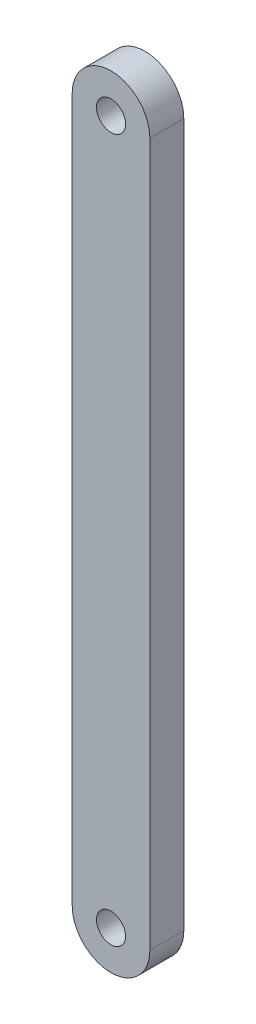
ISO-10303-21;
HEADER;
FILE_DESCRIPTION(('STEP AP214'),'2;1');
FILE_NAME('part.step','',(''),(''),'','','');
FILE_SCHEMA(('AUTOMOTIVE_DESIGN { 1 0 10303 214 1 1 1 1 }'));
ENDSEC;
DATA;
#1=APPLICATION_CONTEXT('core data for automotive mechanical design processes');
#2=APPLICATION_PROTOCOL_DEFINITION('international standard','automotive_design',2000,#1);
#3=PRODUCT_CONTEXT('',#1,'mechanical');
#4=PRODUCT('Part','Part','',(#3));
#5=PRODUCT_RELATED_PRODUCT_CATEGORY('part','',(#4));
#6=PRODUCT_DEFINITION_FORMATION('','',#4);
#7=PRODUCT_DEFINITION_CONTEXT('part definition',#1,'design');
#8=PRODUCT_DEFINITION('design','',#6,#7);
#9=PRODUCT_DEFINITION_SHAPE('','',#8);
#10=(LENGTH_UNIT() NAMED_UNIT(*) SI_UNIT(.MILLI.,.METRE.));
#11=(NAMED_UNIT(*) PLANE_ANGLE_UNIT() SI_UNIT($,.RADIAN.));
#12=(NAMED_UNIT(*) SI_UNIT($,.STERADIAN.) SOLID_ANGLE_UNIT());
#13=UNCERTAINTY_MEASURE_WITH_UNIT(LENGTH_MEASURE(1.E-05),#10,'distance_accuracy_value','');
#14=(GEOMETRIC_REPRESENTATION_CONTEXT(3) GLOBAL_UNCERTAINTY_ASSIGNED_CONTEXT((#13)) GLOBAL_UNIT_ASSIGNED_CONTEXT((#10,
#11,#12)) REPRESENTATION_CONTEXT('',''));
#15=CARTESIAN_POINT('',(0.,0.,0.));
#16=DIRECTION('',(0.,0.,1.));
#17=DIRECTION('',(1.,0.,0.));
#18=AXIS2_PLACEMENT_3D('',#15,#16,#17);
#19=CARTESIAN_POINT('',(0.,72.5,3.5));
#20=DIRECTION('',(0.,0.,-1.));
#21=DIRECTION('',(-1.,0.,0.));
#22=AXIS2_PLACEMENT_3D('',#19,#20,#21);
#23=PLANE('',#22);
#24=CARTESIAN_POINT('',(0.,72.5,3.5));
#25=DIRECTION('',(0.,0.,1.));
#26=DIRECTION('',(-1.,0.,0.));
#27=AXIS2_PLACEMENT_3D('',#24,#25,#26);
#28=CIRCLE('',#27,4.);
#29=CARTESIAN_POINT('',(4.,72.5,3.5));
#30=VERTEX_POINT('',#29);
#31=CARTESIAN_POINT('',(-4.,72.5,3.5));
#32=VERTEX_POINT('',#31);
#33=EDGE_CURVE('E89',#30,#32,#28,.T.);
#34=ORIENTED_EDGE('',*,*,#33,.T.);
#35=DIRECTION('',(0.,-1.,0.));
#36=VECTOR('',#35,1.);
#37=CARTESIAN_POINT('',(-4.,72.5,3.5));
#38=LINE('',#37,#36);
#39=CARTESIAN_POINT('',(-4.,0.,3.5));
#40=VERTEX_POINT('',#39);
#41=EDGE_CURVE('E84',#32,#40,#38,.T.);
#42=ORIENTED_EDGE('',*,*,#41,.T.);
#43=CARTESIAN_POINT('',(0.,0.,3.5));
#44=DIRECTION('',(0.,0.,1.));
#45=DIRECTION('',(1.,0.,0.));
#46=AXIS2_PLACEMENT_3D('',#43,#44,#45);
#47=CIRCLE('',#46,4.);
#48=CARTESIAN_POINT('',(4.,0.,3.5));
#49=VERTEX_POINT('',#48);
#50=EDGE_CURVE('E87',#40,#49,#47,.T.);
#51=ORIENTED_EDGE('',*,*,#50,.T.);
#52=DIRECTION('',(0.,1.,0.));
#53=VECTOR('',#52,1.);
#54=CARTESIAN_POINT('',(4.,0.,3.5));
#55=LINE('',#54,#53);
#56=EDGE_CURVE('E54',#49,#30,#55,.T.);
#57=ORIENTED_EDGE('',*,*,#56,.T.);
#58=EDGE_LOOP('',(#34,#42,#51,#57));
#59=FACE_BOUND('',#58,.T.);
#60=CARTESIAN_POINT('',(0.,72.5,3.5));
#61=DIRECTION('',(0.,0.,1.));
#62=DIRECTION('',(1.,0.,0.));
#63=AXIS2_PLACEMENT_3D('',#60,#61,#62);
#64=CIRCLE('',#63,1.5);
#65=CARTESIAN_POINT('',(1.5,72.5,3.5));
#66=VERTEX_POINT('',#65);
#67=EDGE_CURVE('E104',#66,#66,#64,.T.);
#68=ORIENTED_EDGE('',*,*,#67,.F.);
#69=EDGE_LOOP('',(#68));
#70=FACE_BOUND('',#69,.T.);
#71=CARTESIAN_POINT('',(0.,0.,3.5));
#72=DIRECTION('',(0.,0.,1.));
#73=DIRECTION('',(1.,0.,0.));
#74=AXIS2_PLACEMENT_3D('',#71,#72,#73);
#75=CIRCLE('',#74,1.5);
#76=CARTESIAN_POINT('',(1.5,0.,3.5));
#77=VERTEX_POINT('',#76);
#78=EDGE_CURVE('E119',#77,#77,#75,.T.);
#79=ORIENTED_EDGE('',*,*,#78,.F.);
#80=EDGE_LOOP('',(#79));
#81=FACE_BOUND('',#80,.T.);
#82=ADVANCED_FACE('F37',(#59,#70,#81),#23,.F.);
#83=CARTESIAN_POINT('',(0.,72.5,0.));
#84=DIRECTION('',(0.,0.,-1.));
#85=DIRECTION('',(-1.,0.,0.));
#86=AXIS2_PLACEMENT_3D('',#83,#84,#85);
#87=PLANE('',#86);
#88=CARTESIAN_POINT('',(0.,72.5,0.));
#89=DIRECTION('',(0.,0.,1.));
#90=DIRECTION('',(1.,0.,0.));
#91=AXIS2_PLACEMENT_3D('',#88,#89,#90);
#92=CIRCLE('',#91,1.5);
#93=CARTESIAN_POINT('',(1.5,72.5,0.));
#94=VERTEX_POINT('',#93);
#95=EDGE_CURVE('E116',#94,#94,#92,.T.);
#96=ORIENTED_EDGE('',*,*,#95,.T.);
#97=EDGE_LOOP('',(#96));
#98=FACE_BOUND('',#97,.T.);
#99=CARTESIAN_POINT('',(0.,72.5,0.));
#100=DIRECTION('',(0.,0.,1.));
#101=DIRECTION('',(-1.,0.,0.));
#102=AXIS2_PLACEMENT_3D('',#99,#100,#101);
#103=CIRCLE('',#102,4.);
#104=CARTESIAN_POINT('',(4.,72.5,0.));
#105=VERTEX_POINT('',#104);
#106=CARTESIAN_POINT('',(-4.,72.5,0.));
#107=VERTEX_POINT('',#106);
#108=EDGE_CURVE('E101',#105,#107,#103,.T.);
#109=ORIENTED_EDGE('',*,*,#108,.F.);
#110=DIRECTION('',(0.,1.,0.));
#111=VECTOR('',#110,1.);
#112=CARTESIAN_POINT('',(4.,0.,0.));
#113=LINE('',#112,#111);
#114=CARTESIAN_POINT('',(4.,0.,0.));
#115=VERTEX_POINT('',#114);
#116=EDGE_CURVE('E77',#115,#105,#113,.T.);
#117=ORIENTED_EDGE('',*,*,#116,.F.);
#118=CARTESIAN_POINT('',(0.,0.,0.));
#119=DIRECTION('',(0.,0.,1.));
#120=DIRECTION('',(1.,0.,0.));
#121=AXIS2_PLACEMENT_3D('',#118,#119,#120);
#122=CIRCLE('',#121,4.);
#123=CARTESIAN_POINT('',(-4.,0.,0.));
#124=VERTEX_POINT('',#123);
#125=EDGE_CURVE('E71',#124,#115,#122,.T.);
#126=ORIENTED_EDGE('',*,*,#125,.F.);
#127=DIRECTION('',(0.,-1.,0.));
#128=VECTOR('',#127,1.);
#129=CARTESIAN_POINT('',(-4.,72.5,0.));
#130=LINE('',#129,#128);
#131=EDGE_CURVE('E93',#107,#124,#130,.T.);
#132=ORIENTED_EDGE('',*,*,#131,.F.);
#133=EDGE_LOOP('',(#109,#117,#126,#132));
#134=FACE_BOUND('',#133,.T.);
#135=CARTESIAN_POINT('',(0.,0.,0.));
#136=DIRECTION('',(0.,0.,1.));
#137=DIRECTION('',(1.,0.,0.));
#138=AXIS2_PLACEMENT_3D('',#135,#136,#137);
#139=CIRCLE('',#138,1.5);
#140=CARTESIAN_POINT('',(1.5,0.,0.));
#141=VERTEX_POINT('',#140);
#142=EDGE_CURVE('E122',#141,#141,#139,.T.);
#143=ORIENTED_EDGE('',*,*,#142,.T.);
#144=EDGE_LOOP('',(#143));
#145=FACE_BOUND('',#144,.T.);
#146=ADVANCED_FACE('F112',(#98,#134,#145),#87,.T.);
#147=CARTESIAN_POINT('',(0.,72.5,3.5));
#148=DIRECTION('',(0.,0.,-1.));
#149=DIRECTION('',(-1.,0.,0.));
#150=AXIS2_PLACEMENT_3D('',#147,#148,#149);
#151=CYLINDRICAL_SURFACE('',#150,4.);
#152=ORIENTED_EDGE('',*,*,#108,.T.);
#153=DIRECTION('',(0.,0.,-1.));
#154=VECTOR('',#153,1.);
#155=CARTESIAN_POINT('',(-4.,72.5,3.5));
#156=LINE('',#155,#154);
#157=EDGE_CURVE('E11',#32,#107,#156,.T.);
#158=ORIENTED_EDGE('',*,*,#157,.F.);
#159=ORIENTED_EDGE('',*,*,#33,.F.);
#160=DIRECTION('',(0.,0.,-1.));
#161=VECTOR('',#160,1.);
#162=CARTESIAN_POINT('',(4.,72.5,3.5));
#163=LINE('',#162,#161);
#164=EDGE_CURVE('E97',#30,#105,#163,.T.);
#165=ORIENTED_EDGE('',*,*,#164,.T.);
#166=EDGE_LOOP('',(#152,#158,#159,#165));
#167=FACE_BOUND('',#166,.T.);
#168=ADVANCED_FACE('F39',(#167),#151,.T.);
#169=CARTESIAN_POINT('',(-4.,72.5,3.5));
#170=DIRECTION('',(1.,0.,0.));
#171=DIRECTION('',(0.,0.,-1.));
#172=AXIS2_PLACEMENT_3D('',#169,#170,#171);
#173=PLANE('',#172);
#174=ORIENTED_EDGE('',*,*,#131,.T.);
#175=DIRECTION('',(0.,0.,-1.));
#176=VECTOR('',#175,1.);
#177=CARTESIAN_POINT('',(-4.,0.,3.5));
#178=LINE('',#177,#176);
#179=EDGE_CURVE('E46',#40,#124,#178,.T.);
#180=ORIENTED_EDGE('',*,*,#179,.F.);
#181=ORIENTED_EDGE('',*,*,#41,.F.);
#182=ORIENTED_EDGE('',*,*,#157,.T.);
#183=EDGE_LOOP('',(#174,#180,#181,#182));
#184=FACE_BOUND('',#183,.T.);
#185=ADVANCED_FACE('F92',(#184),#173,.F.);
#186=CARTESIAN_POINT('',(0.,0.,3.5));
#187=DIRECTION('',(0.,0.,-1.));
#188=DIRECTION('',(-1.,0.,0.));
#189=AXIS2_PLACEMENT_3D('',#186,#187,#188);
#190=CYLINDRICAL_SURFACE('',#189,4.);
#191=ORIENTED_EDGE('',*,*,#125,.T.);
#192=DIRECTION('',(0.,0.,-1.));
#193=VECTOR('',#192,1.);
#194=CARTESIAN_POINT('',(4.,0.,3.5));
#195=LINE('',#194,#193);
#196=EDGE_CURVE('E94',#49,#115,#195,.T.);
#197=ORIENTED_EDGE('',*,*,#196,.F.);
#198=ORIENTED_EDGE('',*,*,#50,.F.);
#199=ORIENTED_EDGE('',*,*,#179,.T.);
#200=EDGE_LOOP('',(#191,#197,#198,#199));
#201=FACE_BOUND('',#200,.T.);
#202=ADVANCED_FACE('F95',(#201),#190,.T.);
#203=CARTESIAN_POINT('',(4.,0.,3.5));
#204=DIRECTION('',(-1.,0.,0.));
#205=DIRECTION('',(0.,0.,1.));
#206=AXIS2_PLACEMENT_3D('',#203,#204,#205);
#207=PLANE('',#206);
#208=ORIENTED_EDGE('',*,*,#116,.T.);
#209=ORIENTED_EDGE('',*,*,#164,.F.);
#210=ORIENTED_EDGE('',*,*,#56,.F.);
#211=ORIENTED_EDGE('',*,*,#196,.T.);
#212=EDGE_LOOP('',(#208,#209,#210,#211));
#213=FACE_BOUND('',#212,.T.);
#214=ADVANCED_FACE('F109',(#213),#207,.F.);
#215=CARTESIAN_POINT('',(0.,72.5,3.5));
#216=DIRECTION('',(0.,0.,-1.));
#217=DIRECTION('',(-1.,0.,0.));
#218=AXIS2_PLACEMENT_3D('',#215,#216,#217);
#219=CYLINDRICAL_SURFACE('',#218,1.5);
#220=ORIENTED_EDGE('',*,*,#67,.T.);
#221=EDGE_LOOP('',(#220));
#222=FACE_BOUND('',#221,.T.);
#223=ORIENTED_EDGE('',*,*,#95,.F.);
#224=EDGE_LOOP('',(#223));
#225=FACE_BOUND('',#224,.T.);
#226=ADVANCED_FACE('F139',(#222,#225),#219,.F.);
#227=CARTESIAN_POINT('',(0.,0.,3.5));
#228=DIRECTION('',(0.,0.,-1.));
#229=DIRECTION('',(-1.,0.,0.));
#230=AXIS2_PLACEMENT_3D('',#227,#228,#229);
#231=CYLINDRICAL_SURFACE('',#230,1.5);
#232=ORIENTED_EDGE('',*,*,#78,.T.);
#233=EDGE_LOOP('',(#232));
#234=FACE_BOUND('',#233,.T.);
#235=ORIENTED_EDGE('',*,*,#142,.F.);
#236=EDGE_LOOP('',(#235));
#237=FACE_BOUND('',#236,.T.);
#238=ADVANCED_FACE('F128',(#234,#237),#231,.F.);
#239=CLOSED_SHELL('',(#82,#146,#168,#185,#202,#214,#226,#238));
#240=MANIFOLD_SOLID_BREP('B2',#239);
#241=ADVANCED_BREP_SHAPE_REPRESENTATION('',(#18,#240),#14);
#242=SHAPE_DEFINITION_REPRESENTATION(#9,#241);
ENDSEC;
END-ISO-10303-21;
